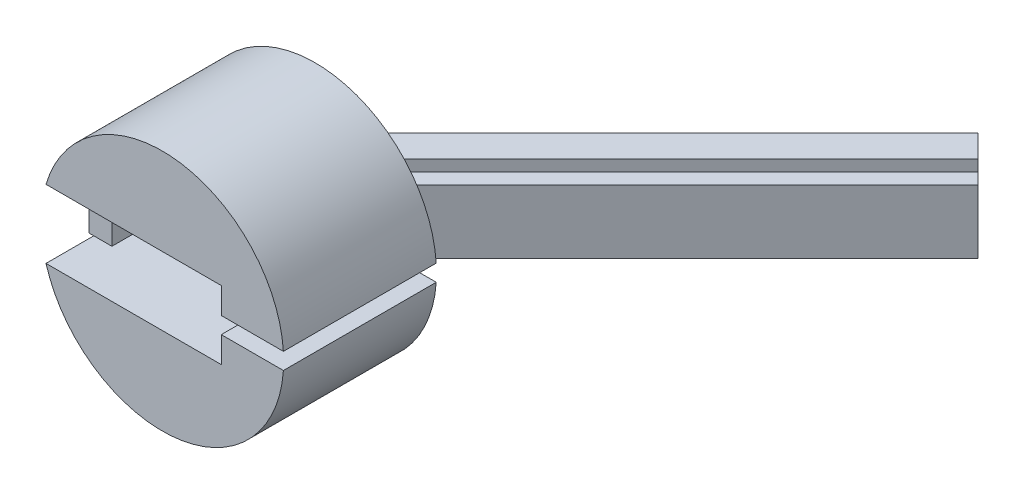
ISO-10303-21;
HEADER;
FILE_DESCRIPTION(('STEP AP214'),'2;1');
FILE_NAME('part.step','',(''),(''),'','','');
FILE_SCHEMA(('AUTOMOTIVE_DESIGN { 1 0 10303 214 1 1 1 1 }'));
ENDSEC;
DATA;
#1=APPLICATION_CONTEXT('core data for automotive mechanical design processes');
#2=APPLICATION_PROTOCOL_DEFINITION('international standard','automotive_design',2000,#1);
#3=PRODUCT_CONTEXT('',#1,'mechanical');
#4=PRODUCT('Part','Part','',(#3));
#5=PRODUCT_RELATED_PRODUCT_CATEGORY('part','',(#4));
#6=PRODUCT_DEFINITION_FORMATION('','',#4);
#7=PRODUCT_DEFINITION_CONTEXT('part definition',#1,'design');
#8=PRODUCT_DEFINITION('design','',#6,#7);
#9=PRODUCT_DEFINITION_SHAPE('','',#8);
#10=(LENGTH_UNIT() NAMED_UNIT(*) SI_UNIT(.MILLI.,.METRE.));
#11=(NAMED_UNIT(*) PLANE_ANGLE_UNIT() SI_UNIT($,.RADIAN.));
#12=(NAMED_UNIT(*) SI_UNIT($,.STERADIAN.) SOLID_ANGLE_UNIT());
#13=UNCERTAINTY_MEASURE_WITH_UNIT(LENGTH_MEASURE(1.E-05),#10,'distance_accuracy_value','');
#14=(GEOMETRIC_REPRESENTATION_CONTEXT(3) GLOBAL_UNCERTAINTY_ASSIGNED_CONTEXT((#13)) GLOBAL_UNIT_ASSIGNED_CONTEXT((#10,
#11,#12)) REPRESENTATION_CONTEXT('',''));
#15=CARTESIAN_POINT('',(0.,0.,0.));
#16=DIRECTION('',(0.,0.,1.));
#17=DIRECTION('',(1.,0.,0.));
#18=AXIS2_PLACEMENT_3D('',#15,#16,#17);
#19=CARTESIAN_POINT('',(0.,0.,0.));
#20=DIRECTION('',(0.,0.,1.));
#21=DIRECTION('',(1.,0.,0.));
#22=AXIS2_PLACEMENT_3D('',#19,#20,#21);
#23=PLANE('',#22);
#24=DIRECTION('',(1.,0.,0.));
#25=VECTOR('',#24,1.);
#26=CARTESIAN_POINT('',(-36.5522478279135,10.749101298564,0.));
#27=LINE('',#26,#25);
#28=CARTESIAN_POINT('',(-36.5522478279135,10.749101298564,0.));
#29=VERTEX_POINT('',#28);
#30=CARTESIAN_POINT('',(-30.84910129856,10.749101298564,0.));
#31=VERTEX_POINT('',#30);
#32=EDGE_CURVE('E49',#29,#31,#27,.T.);
#33=ORIENTED_EDGE('',*,*,#32,.F.);
#34=DIRECTION('',(1.,0.,0.));
#35=VECTOR('',#34,1.);
#36=CARTESIAN_POINT('',(-38.1,10.749101298564,0.));
#37=LINE('',#36,#35);
#38=CARTESIAN_POINT('',(-38.1,10.749101298564,0.));
#39=VERTEX_POINT('',#38);
#40=EDGE_CURVE('E461',#39,#29,#37,.T.);
#41=ORIENTED_EDGE('',*,*,#40,.F.);
#42=DIRECTION('',(0.,1.,0.));
#43=VECTOR('',#42,1.);
#44=CARTESIAN_POINT('',(-38.1,-10.749101298564,0.));
#45=LINE('',#44,#43);
#46=CARTESIAN_POINT('',(-38.1,-10.749101298564,0.));
#47=VERTEX_POINT('',#46);
#48=EDGE_CURVE('E460',#47,#39,#45,.T.);
#49=ORIENTED_EDGE('',*,*,#48,.F.);
#50=DIRECTION('',(1.,0.,0.));
#51=VECTOR('',#50,1.);
#52=CARTESIAN_POINT('',(-38.1,-10.749101298564,0.));
#53=LINE('',#52,#51);
#54=CARTESIAN_POINT('',(-36.5522478279135,-10.749101298564,0.));
#55=VERTEX_POINT('',#54);
#56=EDGE_CURVE('E454',#47,#55,#53,.T.);
#57=ORIENTED_EDGE('',*,*,#56,.T.);
#58=DIRECTION('',(-1.,0.,0.));
#59=VECTOR('',#58,1.);
#60=CARTESIAN_POINT('',(-36.5522478279135,-10.749101298564,0.));
#61=LINE('',#60,#59);
#62=CARTESIAN_POINT('',(-30.84910129856,-10.74910129856,0.));
#63=VERTEX_POINT('',#62);
#64=EDGE_CURVE('E48',#63,#55,#61,.T.);
#65=ORIENTED_EDGE('',*,*,#64,.F.);
#66=DIRECTION('',(0.,-1.,0.));
#67=VECTOR('',#66,1.);
#68=CARTESIAN_POINT('',(-30.84910129856,10.749101298564,0.));
#69=LINE('',#68,#67);
#70=EDGE_CURVE('E443',#31,#63,#69,.T.);
#71=ORIENTED_EDGE('',*,*,#70,.F.);
#72=EDGE_LOOP('',(#33,#41,#49,#57,#65,#71));
#73=FACE_BOUND('',#72,.T.);
#74=ADVANCED_FACE('F39',(#73),#23,.T.);
#75=DIRECTION('',(0.,-1.,0.));
#76=VECTOR('',#75,1.);
#77=CARTESIAN_POINT('',(18.5,10.749101298564,0.));
#78=LINE('',#77,#76);
#79=CARTESIAN_POINT('',(18.5,10.749101298564,0.));
#80=VERTEX_POINT('',#79);
#81=CARTESIAN_POINT('',(18.5,2.6,0.));
#82=VERTEX_POINT('',#81);
#83=EDGE_CURVE('E272',#80,#82,#78,.T.);
#84=ORIENTED_EDGE('',*,*,#83,.F.);
#85=CARTESIAN_POINT('',(10.849101298564,10.749101298564,0.));
#86=VERTEX_POINT('',#85);
#87=EDGE_CURVE('E11',#86,#80,#27,.T.);
#88=ORIENTED_EDGE('',*,*,#87,.F.);
#89=DIRECTION('',(0.,1.,0.));
#90=VECTOR('',#89,1.);
#91=CARTESIAN_POINT('',(10.849101298564,4.6,0.));
#92=LINE('',#91,#90);
#93=CARTESIAN_POINT('',(10.849101298564,4.6,0.));
#94=VERTEX_POINT('',#93);
#95=EDGE_CURVE('E441',#94,#86,#92,.T.);
#96=ORIENTED_EDGE('',*,*,#95,.F.);
#97=DIRECTION('',(-0.707106781186547,0.707106781186548,0.));
#98=VECTOR('',#97,1.);
#99=CARTESIAN_POINT('',(12.849101298564,2.6,0.));
#100=LINE('',#99,#98);
#101=CARTESIAN_POINT('',(12.849101298564,2.6,0.));
#102=VERTEX_POINT('',#101);
#103=EDGE_CURVE('E438',#102,#94,#100,.T.);
#104=ORIENTED_EDGE('',*,*,#103,.F.);
#105=DIRECTION('',(-1.,0.,0.));
#106=VECTOR('',#105,1.);
#107=CARTESIAN_POINT('',(38.0111825651347,2.6,0.));
#108=LINE('',#107,#106);
#109=EDGE_CURVE('E64',#82,#102,#108,.T.);
#110=ORIENTED_EDGE('',*,*,#109,.F.);
#111=EDGE_LOOP('',(#84,#88,#96,#104,#110));
#112=FACE_BOUND('',#111,.T.);
#113=ADVANCED_FACE('F497',(#112),#23,.T.);
#114=CARTESIAN_POINT('',(0.,0.,-33.));
#115=DIRECTION('',(0.,0.,-1.));
#116=DIRECTION('',(-1.,0.,0.));
#117=AXIS2_PLACEMENT_3D('',#114,#115,#116);
#118=PLANE('',#117);
#119=CARTESIAN_POINT('',(0.,0.,-33.));
#120=DIRECTION('',(0.,0.,-1.));
#121=DIRECTION('',(-1.,0.,0.));
#122=AXIS2_PLACEMENT_3D('',#119,#120,#121);
#123=CIRCLE('',#122,38.1);
#124=CARTESIAN_POINT('',(-36.5522478279135,10.749101298564,-33.));
#125=VERTEX_POINT('',#124);
#126=CARTESIAN_POINT('',(38.0111825651347,2.6,-33.));
#127=VERTEX_POINT('',#126);
#128=EDGE_CURVE('E391',#125,#127,#123,.T.);
#129=ORIENTED_EDGE('',*,*,#128,.T.);
#130=DIRECTION('',(-1.,0.,0.));
#131=VECTOR('',#130,1.);
#132=CARTESIAN_POINT('',(38.0111825651347,2.6,-33.));
#133=LINE('',#132,#131);
#134=CARTESIAN_POINT('',(12.849101298564,2.6,-33.));
#135=VERTEX_POINT('',#134);
#136=EDGE_CURVE('E392',#127,#135,#133,.T.);
#137=ORIENTED_EDGE('',*,*,#136,.T.);
#138=DIRECTION('',(0.,-1.,0.));
#139=VECTOR('',#138,1.);
#140=CARTESIAN_POINT('',(12.849101298564,2.6,-33.));
#141=LINE('',#140,#139);
#142=CARTESIAN_POINT('',(12.849101298564,-2.6,-33.));
#143=VERTEX_POINT('',#142);
#144=EDGE_CURVE('E400',#135,#143,#141,.T.);
#145=ORIENTED_EDGE('',*,*,#144,.T.);
#146=DIRECTION('',(1.,0.,0.));
#147=VECTOR('',#146,1.);
#148=CARTESIAN_POINT('',(12.849101298564,-2.6,-33.));
#149=LINE('',#148,#147);
#150=CARTESIAN_POINT('',(38.0111825651347,-2.60000000000001,-33.));
#151=VERTEX_POINT('',#150);
#152=EDGE_CURVE('E397',#143,#151,#149,.T.);
#153=ORIENTED_EDGE('',*,*,#152,.T.);
#154=CARTESIAN_POINT('',(0.,0.,-33.));
#155=DIRECTION('',(0.,0.,-1.));
#156=DIRECTION('',(-1.,0.,0.));
#157=AXIS2_PLACEMENT_3D('',#154,#155,#156);
#158=CIRCLE('',#157,38.1);
#159=CARTESIAN_POINT('',(-36.5522478279135,-10.749101298564,-33.));
#160=VERTEX_POINT('',#159);
#161=EDGE_CURVE('E405',#151,#160,#158,.T.);
#162=ORIENTED_EDGE('',*,*,#161,.T.);
#163=DIRECTION('',(-1.,0.,0.));
#164=VECTOR('',#163,1.);
#165=CARTESIAN_POINT('',(-36.5522478279135,-10.749101298564,-33.));
#166=LINE('',#165,#164);
#167=CARTESIAN_POINT('',(-38.1,-10.749101298564,-33.));
#168=VERTEX_POINT('',#167);
#169=EDGE_CURVE('E403',#160,#168,#166,.T.);
#170=ORIENTED_EDGE('',*,*,#169,.T.);
#171=DIRECTION('',(0.,1.,0.));
#172=VECTOR('',#171,1.);
#173=CARTESIAN_POINT('',(-38.1,-10.749101298564,-33.));
#174=LINE('',#173,#172);
#175=CARTESIAN_POINT('',(-38.1,10.749101298564,-33.));
#176=VERTEX_POINT('',#175);
#177=EDGE_CURVE('E407',#168,#176,#174,.T.);
#178=ORIENTED_EDGE('',*,*,#177,.T.);
#179=DIRECTION('',(1.,0.,0.));
#180=VECTOR('',#179,1.);
#181=CARTESIAN_POINT('',(-38.1,10.749101298564,-33.));
#182=LINE('',#181,#180);
#183=EDGE_CURVE('E414',#176,#125,#182,.T.);
#184=ORIENTED_EDGE('',*,*,#183,.T.);
#185=EDGE_LOOP('',(#129,#137,#145,#153,#162,#170,#178,#184));
#186=FACE_BOUND('',#185,.T.);
#187=DIRECTION('',(0.,-1.,0.));
#188=VECTOR('',#187,1.);
#189=CARTESIAN_POINT('',(-3.95786437626908,10.,-33.));
#190=LINE('',#189,#188);
#191=CARTESIAN_POINT('',(-3.95786437626908,-5.,-33.));
#192=VERTEX_POINT('',#191);
#193=CARTESIAN_POINT('',(-3.95786437626908,-10.,-33.));
#194=VERTEX_POINT('',#193);
#195=EDGE_CURVE('E390',#192,#194,#190,.T.);
#196=ORIENTED_EDGE('',*,*,#195,.F.);
#197=DIRECTION('',(1.,0.,0.));
#198=VECTOR('',#197,1.);
#199=CARTESIAN_POINT('',(-15.9728306023233,-5.,-33.));
#200=LINE('',#199,#198);
#201=CARTESIAN_POINT('',(3.11320343559663,-5.,-33.));
#202=VERTEX_POINT('',#201);
#203=EDGE_CURVE('E318',#192,#202,#200,.T.);
#204=ORIENTED_EDGE('',*,*,#203,.T.);
#205=DIRECTION('',(0.,-1.,0.));
#206=VECTOR('',#205,1.);
#207=CARTESIAN_POINT('',(3.11320343559663,-10.,-33.));
#208=LINE('',#207,#206);
#209=CARTESIAN_POINT('',(3.11320343559663,-10.,-33.));
#210=VERTEX_POINT('',#209);
#211=EDGE_CURVE('E319',#202,#210,#208,.T.);
#212=ORIENTED_EDGE('',*,*,#211,.T.);
#213=DIRECTION('',(1.,0.,0.));
#214=VECTOR('',#213,1.);
#215=CARTESIAN_POINT('',(-12.4372966963906,-10.,-33.));
#216=LINE('',#215,#214);
#217=CARTESIAN_POINT('',(10.1842712474621,-10.,-33.));
#218=VERTEX_POINT('',#217);
#219=EDGE_CURVE('E317',#210,#218,#216,.T.);
#220=ORIENTED_EDGE('',*,*,#219,.T.);
#221=DIRECTION('',(0.,1.,0.));
#222=VECTOR('',#221,1.);
#223=CARTESIAN_POINT('',(10.1842712474621,10.,-33.));
#224=LINE('',#223,#222);
#225=CARTESIAN_POINT('',(10.1842712474621,10.,-33.));
#226=VERTEX_POINT('',#225);
#227=EDGE_CURVE('E313',#218,#226,#224,.T.);
#228=ORIENTED_EDGE('',*,*,#227,.T.);
#229=DIRECTION('',(-1.,0.,0.));
#230=VECTOR('',#229,1.);
#231=CARTESIAN_POINT('',(-15.9728306023233,10.,-33.));
#232=LINE('',#231,#230);
#233=CARTESIAN_POINT('',(3.11320343559663,10.,-33.));
#234=VERTEX_POINT('',#233);
#235=EDGE_CURVE('E311',#226,#234,#232,.T.);
#236=ORIENTED_EDGE('',*,*,#235,.T.);
#237=DIRECTION('',(0.,-1.,0.));
#238=VECTOR('',#237,1.);
#239=CARTESIAN_POINT('',(3.11320343559663,5.,-33.));
#240=LINE('',#239,#238);
#241=CARTESIAN_POINT('',(3.11320343559663,5.,-33.));
#242=VERTEX_POINT('',#241);
#243=EDGE_CURVE('E307',#234,#242,#240,.T.);
#244=ORIENTED_EDGE('',*,*,#243,.T.);
#245=DIRECTION('',(-1.,0.,0.));
#246=VECTOR('',#245,1.);
#247=CARTESIAN_POINT('',(-19.5083645082561,5.,-33.));
#248=LINE('',#247,#246);
#249=CARTESIAN_POINT('',(-3.95786437626908,5.,-33.));
#250=VERTEX_POINT('',#249);
#251=EDGE_CURVE('E321',#242,#250,#248,.T.);
#252=ORIENTED_EDGE('',*,*,#251,.T.);
#253=CARTESIAN_POINT('',(-3.95786437626908,10.,-33.));
#254=VERTEX_POINT('',#253);
#255=EDGE_CURVE('E387',#254,#250,#190,.T.);
#256=ORIENTED_EDGE('',*,*,#255,.F.);
#257=DIRECTION('',(1.,0.,0.));
#258=VECTOR('',#257,1.);
#259=CARTESIAN_POINT('',(-18.1,10.,-33.));
#260=LINE('',#259,#258);
#261=CARTESIAN_POINT('',(-18.1,10.,-33.));
#262=VERTEX_POINT('',#261);
#263=EDGE_CURVE('E356',#262,#254,#260,.T.);
#264=ORIENTED_EDGE('',*,*,#263,.F.);
#265=DIRECTION('',(0.,-1.,0.));
#266=VECTOR('',#265,1.);
#267=CARTESIAN_POINT('',(-18.1,10.,-33.));
#268=LINE('',#267,#266);
#269=CARTESIAN_POINT('',(-18.1,-10.,-33.));
#270=VERTEX_POINT('',#269);
#271=EDGE_CURVE('E368',#262,#270,#268,.T.);
#272=ORIENTED_EDGE('',*,*,#271,.T.);
#273=DIRECTION('',(1.,0.,0.));
#274=VECTOR('',#273,1.);
#275=CARTESIAN_POINT('',(-18.1,-10.,-33.));
#276=LINE('',#275,#274);
#277=EDGE_CURVE('E357',#270,#194,#276,.T.);
#278=ORIENTED_EDGE('',*,*,#277,.T.);
#279=EDGE_LOOP('',(#196,#204,#212,#220,#228,#236,#244,#252,#256,#264,#272,#278));
#280=FACE_BOUND('',#279,.T.);
#281=ADVANCED_FACE('F519',(#186,#280),#118,.T.);
#282=CARTESIAN_POINT('',(-3.95786437626908,10.,-33.));
#283=DIRECTION('',(-0.707106781186549,0.,-0.707106781186546));
#284=DIRECTION('',(-0.707106781186546,0.,0.707106781186549));
#285=AXIS2_PLACEMENT_3D('',#282,#283,#284);
#286=PLANE('',#285);
#287=DIRECTION('',(0.707106781186545,0.,-0.70710678118655));
#288=VECTOR('',#287,1.);
#289=CARTESIAN_POINT('',(-19.5083645082562,-5.,-17.4494998680128));
#290=LINE('',#289,#288);
#291=CARTESIAN_POINT('',(102.108152801713,-5.,-139.066017177982));
#292=VERTEX_POINT('',#291);
#293=EDGE_CURVE('E315',#192,#292,#290,.T.);
#294=ORIENTED_EDGE('',*,*,#293,.F.);
#295=ORIENTED_EDGE('',*,*,#195,.T.);
#296=DIRECTION('',(0.707106781186546,0.,-0.707106781186549));
#297=VECTOR('',#296,1.);
#298=CARTESIAN_POINT('',(-3.95786437626908,-10.,-33.));
#299=LINE('',#298,#297);
#300=CARTESIAN_POINT('',(102.108152801713,-10.,-139.066017177982));
#301=VERTEX_POINT('',#300);
#302=EDGE_CURVE('E371',#194,#301,#299,.T.);
#303=ORIENTED_EDGE('',*,*,#302,.T.);
#304=DIRECTION('',(0.,-1.,0.));
#305=VECTOR('',#304,1.);
#306=CARTESIAN_POINT('',(102.108152801713,10.,-139.066017177982));
#307=LINE('',#306,#305);
#308=EDGE_CURVE('E384',#292,#301,#307,.T.);
#309=ORIENTED_EDGE('',*,*,#308,.F.);
#310=EDGE_LOOP('',(#294,#295,#303,#309));
#311=FACE_BOUND('',#310,.T.);
#312=ADVANCED_FACE('F613',(#311),#286,.F.);
#313=CARTESIAN_POINT('',(38.0111825651347,2.6,-135.700288353668));
#314=DIRECTION('',(0.,1.,0.));
#315=DIRECTION('',(0.,0.,1.));
#316=AXIS2_PLACEMENT_3D('',#313,#314,#315);
#317=PLANE('',#316);
#318=DIRECTION('',(0.,0.,1.));
#319=VECTOR('',#318,1.);
#320=CARTESIAN_POINT('',(12.849101298564,2.6,-135.700288353668));
#321=LINE('',#320,#319);
#322=CARTESIAN_POINT('',(12.849101298564,2.6,-28.));
#323=VERTEX_POINT('',#322);
#324=EDGE_CURVE('E43',#323,#102,#321,.T.);
#325=ORIENTED_EDGE('',*,*,#324,.F.);
#326=DIRECTION('',(0.,0.,1.));
#327=VECTOR('',#326,1.);
#328=CARTESIAN_POINT('',(12.849101298564,2.6,-33.));
#329=LINE('',#328,#327);
#330=EDGE_CURVE('E417',#135,#323,#329,.T.);
#331=ORIENTED_EDGE('',*,*,#330,.F.);
#332=ORIENTED_EDGE('',*,*,#136,.F.);
#333=DIRECTION('',(0.,0.,1.));
#334=VECTOR('',#333,1.);
#335=CARTESIAN_POINT('',(38.0111825651347,2.6,-135.700288353668));
#336=LINE('',#335,#334);
#337=CARTESIAN_POINT('',(38.0111825651347,2.6,15.));
#338=VERTEX_POINT('',#337);
#339=EDGE_CURVE('E463',#127,#338,#336,.T.);
#340=ORIENTED_EDGE('',*,*,#339,.T.);
#341=DIRECTION('',(1.,0.,0.));
#342=VECTOR('',#341,1.);
#343=CARTESIAN_POINT('',(18.5,2.6,15.));
#344=LINE('',#343,#342);
#345=CARTESIAN_POINT('',(18.5,2.6,15.));
#346=VERTEX_POINT('',#345);
#347=EDGE_CURVE('E267',#346,#338,#344,.T.);
#348=ORIENTED_EDGE('',*,*,#347,.F.);
#349=DIRECTION('',(0.,0.,-1.));
#350=VECTOR('',#349,1.);
#351=CARTESIAN_POINT('',(18.5,2.6,15.));
#352=LINE('',#351,#350);
#353=EDGE_CURVE('E285',#346,#82,#352,.T.);
#354=ORIENTED_EDGE('',*,*,#353,.T.);
#355=ORIENTED_EDGE('',*,*,#109,.T.);
#356=EDGE_LOOP('',(#325,#331,#332,#340,#348,#354,#355));
#357=FACE_BOUND('',#356,.T.);
#358=ADVANCED_FACE('F41',(#357),#317,.F.);
#359=CARTESIAN_POINT('',(12.849101298564,2.6,-135.700288353668));
#360=DIRECTION('',(0.707106781186548,0.707106781186547,0.));
#361=DIRECTION('',(-0.707106781186547,0.707106781186548,0.));
#362=AXIS2_PLACEMENT_3D('',#359,#360,#361);
#363=PLANE('',#362);
#364=DIRECTION('',(0.,0.,1.));
#365=VECTOR('',#364,1.);
#366=CARTESIAN_POINT('',(10.849101298564,4.6,-135.700288353668));
#367=LINE('',#366,#365);
#368=CARTESIAN_POINT('',(10.849101298564,4.6,-28.));
#369=VERTEX_POINT('',#368);
#370=EDGE_CURVE('E486',#369,#94,#367,.T.);
#371=ORIENTED_EDGE('',*,*,#370,.F.);
#372=DIRECTION('',(0.707106781186547,-0.707106781186548,0.));
#373=VECTOR('',#372,1.);
#374=CARTESIAN_POINT('',(12.849101298564,2.6,-28.));
#375=LINE('',#374,#373);
#376=EDGE_CURVE('E434',#369,#323,#375,.T.);
#377=ORIENTED_EDGE('',*,*,#376,.T.);
#378=ORIENTED_EDGE('',*,*,#324,.T.);
#379=ORIENTED_EDGE('',*,*,#103,.T.);
#380=EDGE_LOOP('',(#371,#377,#378,#379));
#381=FACE_BOUND('',#380,.T.);
#382=ADVANCED_FACE('F494',(#381),#363,.F.);
#383=CARTESIAN_POINT('',(10.849101298564,4.6,-135.700288353668));
#384=DIRECTION('',(1.,0.,0.));
#385=DIRECTION('',(0.,0.,-1.));
#386=AXIS2_PLACEMENT_3D('',#383,#384,#385);
#387=PLANE('',#386);
#388=DIRECTION('',(0.,0.,1.));
#389=VECTOR('',#388,1.);
#390=CARTESIAN_POINT('',(10.849101298564,10.749101298564,-135.700288353668));
#391=LINE('',#390,#389);
#392=CARTESIAN_POINT('',(10.849101298564,10.749101298564,-28.));
#393=VERTEX_POINT('',#392);
#394=EDGE_CURVE('E488',#393,#86,#391,.T.);
#395=ORIENTED_EDGE('',*,*,#394,.F.);
#396=DIRECTION('',(0.,-1.,0.));
#397=VECTOR('',#396,1.);
#398=CARTESIAN_POINT('',(10.849101298564,4.6,-28.));
#399=LINE('',#398,#397);
#400=EDGE_CURVE('E433',#393,#369,#399,.T.);
#401=ORIENTED_EDGE('',*,*,#400,.T.);
#402=ORIENTED_EDGE('',*,*,#370,.T.);
#403=ORIENTED_EDGE('',*,*,#95,.T.);
#404=EDGE_LOOP('',(#395,#401,#402,#403));
#405=FACE_BOUND('',#404,.T.);
#406=ADVANCED_FACE('F501',(#405),#387,.F.);
#407=CARTESIAN_POINT('',(10.849101298564,10.749101298564,-135.700288353668));
#408=DIRECTION('',(0.,1.,0.));
#409=DIRECTION('',(0.,0.,1.));
#410=AXIS2_PLACEMENT_3D('',#407,#408,#409);
#411=PLANE('',#410);
#412=DIRECTION('',(0.,0.,1.));
#413=VECTOR('',#412,1.);
#414=CARTESIAN_POINT('',(-30.84910129856,10.749101298564,-135.700288353668));
#415=LINE('',#414,#413);
#416=CARTESIAN_POINT('',(-30.84910129856,10.749101298564,-28.));
#417=VERTEX_POINT('',#416);
#418=EDGE_CURVE('E482',#417,#31,#415,.T.);
#419=ORIENTED_EDGE('',*,*,#418,.F.);
#420=DIRECTION('',(1.,0.,0.));
#421=VECTOR('',#420,1.);
#422=CARTESIAN_POINT('',(10.849101298564,10.749101298564,-28.));
#423=LINE('',#422,#421);
#424=EDGE_CURVE('E431',#417,#393,#423,.T.);
#425=ORIENTED_EDGE('',*,*,#424,.T.);
#426=ORIENTED_EDGE('',*,*,#394,.T.);
#427=ORIENTED_EDGE('',*,*,#87,.T.);
#428=DIRECTION('',(0.,0.,-1.));
#429=VECTOR('',#428,1.);
#430=CARTESIAN_POINT('',(18.5,10.749101298564,15.));
#431=LINE('',#430,#429);
#432=CARTESIAN_POINT('',(18.5,10.749101298564,15.));
#433=VERTEX_POINT('',#432);
#434=EDGE_CURVE('E258',#433,#80,#431,.T.);
#435=ORIENTED_EDGE('',*,*,#434,.F.);
#436=DIRECTION('',(1.,0.,0.));
#437=VECTOR('',#436,1.);
#438=CARTESIAN_POINT('',(-36.5522478279135,10.749101298564,15.));
#439=LINE('',#438,#437);
#440=CARTESIAN_POINT('',(-36.5522478279135,10.749101298564,15.));
#441=VERTEX_POINT('',#440);
#442=EDGE_CURVE('E252',#441,#433,#439,.T.);
#443=ORIENTED_EDGE('',*,*,#442,.F.);
#444=DIRECTION('',(0.,0.,-1.));
#445=VECTOR('',#444,1.);
#446=CARTESIAN_POINT('',(-36.5522478279135,10.749101298564,15.));
#447=LINE('',#446,#445);
#448=EDGE_CURVE('E260',#441,#29,#447,.T.);
#449=ORIENTED_EDGE('',*,*,#448,.T.);
#450=ORIENTED_EDGE('',*,*,#32,.T.);
#451=EDGE_LOOP('',(#419,#425,#426,#427,#435,#443,#449,#450));
#452=FACE_BOUND('',#451,.T.);
#453=ADVANCED_FACE('F251',(#452),#411,.F.);
#454=CARTESIAN_POINT('',(-30.84910129856,10.749101298564,-135.700288353668));
#455=DIRECTION('',(-1.,0.,0.));
#456=DIRECTION('',(0.,0.,1.));
#457=AXIS2_PLACEMENT_3D('',#454,#455,#456);
#458=PLANE('',#457);
#459=DIRECTION('',(0.,0.,1.));
#460=VECTOR('',#459,1.);
#461=CARTESIAN_POINT('',(-30.84910129856,-10.74910129856,-135.700288353668));
#462=LINE('',#461,#460);
#463=CARTESIAN_POINT('',(-30.84910129856,-10.74910129856,-28.));
#464=VERTEX_POINT('',#463);
#465=EDGE_CURVE('E481',#464,#63,#462,.T.);
#466=ORIENTED_EDGE('',*,*,#465,.F.);
#467=DIRECTION('',(0.,1.,0.));
#468=VECTOR('',#467,1.);
#469=CARTESIAN_POINT('',(-30.84910129856,10.749101298564,-28.));
#470=LINE('',#469,#468);
#471=EDGE_CURVE('E429',#464,#417,#470,.T.);
#472=ORIENTED_EDGE('',*,*,#471,.T.);
#473=ORIENTED_EDGE('',*,*,#418,.T.);
#474=ORIENTED_EDGE('',*,*,#70,.T.);
#475=EDGE_LOOP('',(#466,#472,#473,#474));
#476=FACE_BOUND('',#475,.T.);
#477=ADVANCED_FACE('F541',(#476),#458,.F.);
#478=CARTESIAN_POINT('',(-30.84910129856,-10.74910129856,-135.700288353668));
#479=DIRECTION('',(0.,-1.,0.));
#480=DIRECTION('',(0.,0.,-1.));
#481=AXIS2_PLACEMENT_3D('',#478,#479,#480);
#482=PLANE('',#481);
#483=DIRECTION('',(0.,0.,1.));
#484=VECTOR('',#483,1.);
#485=CARTESIAN_POINT('',(10.849101298564,-10.74910129856,-135.700288353668));
#486=LINE('',#485,#484);
#487=CARTESIAN_POINT('',(10.849101298564,-10.74910129856,-28.));
#488=VERTEX_POINT('',#487);
#489=CARTESIAN_POINT('',(10.849101298564,-10.74910129856,0.));
#490=VERTEX_POINT('',#489);
#491=EDGE_CURVE('E478',#488,#490,#486,.T.);
#492=ORIENTED_EDGE('',*,*,#491,.F.);
#493=DIRECTION('',(-1.,0.,0.));
#494=VECTOR('',#493,1.);
#495=CARTESIAN_POINT('',(-30.84910129856,-10.74910129856,-28.));
#496=LINE('',#495,#494);
#497=EDGE_CURVE('E430',#488,#464,#496,.T.);
#498=ORIENTED_EDGE('',*,*,#497,.T.);
#499=ORIENTED_EDGE('',*,*,#465,.T.);
#500=ORIENTED_EDGE('',*,*,#64,.T.);
#501=DIRECTION('',(0.,0.,-1.));
#502=VECTOR('',#501,1.);
#503=CARTESIAN_POINT('',(-36.5522478279135,-10.749101298564,15.));
#504=LINE('',#503,#502);
#505=CARTESIAN_POINT('',(-36.5522478279135,-10.749101298564,15.));
#506=VERTEX_POINT('',#505);
#507=EDGE_CURVE('E291',#506,#55,#504,.T.);
#508=ORIENTED_EDGE('',*,*,#507,.F.);
#509=DIRECTION('',(-1.,0.,0.));
#510=VECTOR('',#509,1.);
#511=CARTESIAN_POINT('',(-36.5522478279135,-10.749101298564,15.));
#512=LINE('',#511,#510);
#513=CARTESIAN_POINT('',(18.5,-10.749101298564,15.));
#514=VERTEX_POINT('',#513);
#515=EDGE_CURVE('E298',#514,#506,#512,.T.);
#516=ORIENTED_EDGE('',*,*,#515,.F.);
#517=DIRECTION('',(0.,0.,-1.));
#518=VECTOR('',#517,1.);
#519=CARTESIAN_POINT('',(18.5,-10.749101298564,15.));
#520=LINE('',#519,#518);
#521=CARTESIAN_POINT('',(18.5,-10.749101298564,0.));
#522=VERTEX_POINT('',#521);
#523=EDGE_CURVE('E289',#514,#522,#520,.T.);
#524=ORIENTED_EDGE('',*,*,#523,.T.);
#525=EDGE_CURVE('E300',#522,#490,#61,.T.);
#526=ORIENTED_EDGE('',*,*,#525,.T.);
#527=EDGE_LOOP('',(#492,#498,#499,#500,#508,#516,#524,#526));
#528=FACE_BOUND('',#527,.T.);
#529=ADVANCED_FACE('F540',(#528),#482,.F.);
#530=CARTESIAN_POINT('',(10.849101298564,-10.74910129856,-135.700288353668));
#531=DIRECTION('',(1.,0.,0.));
#532=DIRECTION('',(0.,0.,-1.));
#533=AXIS2_PLACEMENT_3D('',#530,#531,#532);
#534=PLANE('',#533);
#535=DIRECTION('',(0.,0.,1.));
#536=VECTOR('',#535,1.);
#537=CARTESIAN_POINT('',(10.849101298564,-4.60000000000004,-135.700288353668));
#538=LINE('',#537,#536);
#539=CARTESIAN_POINT('',(10.849101298564,-4.60000000000004,-28.));
#540=VERTEX_POINT('',#539);
#541=CARTESIAN_POINT('',(10.849101298564,-4.60000000000004,0.));
#542=VERTEX_POINT('',#541);
#543=EDGE_CURVE('E476',#540,#542,#538,.T.);
#544=ORIENTED_EDGE('',*,*,#543,.F.);
#545=DIRECTION('',(0.,-1.,0.));
#546=VECTOR('',#545,1.);
#547=CARTESIAN_POINT('',(10.849101298564,-10.74910129856,-28.));
#548=LINE('',#547,#546);
#549=EDGE_CURVE('E424',#540,#488,#548,.T.);
#550=ORIENTED_EDGE('',*,*,#549,.T.);
#551=ORIENTED_EDGE('',*,*,#491,.T.);
#552=DIRECTION('',(0.,1.,0.));
#553=VECTOR('',#552,1.);
#554=CARTESIAN_POINT('',(10.849101298564,-10.74910129856,0.));
#555=LINE('',#554,#553);
#556=EDGE_CURVE('E450',#490,#542,#555,.T.);
#557=ORIENTED_EDGE('',*,*,#556,.T.);
#558=EDGE_LOOP('',(#544,#550,#551,#557));
#559=FACE_BOUND('',#558,.T.);
#560=ADVANCED_FACE('F593',(#559),#534,.F.);
#561=CARTESIAN_POINT('',(12.849101298564,-2.6,-135.700288353668));
#562=DIRECTION('',(-0.707106781186554,0.707106781186541,0.));
#563=DIRECTION('',(-0.707106781186541,-0.707106781186554,0.));
#564=AXIS2_PLACEMENT_3D('',#561,#562,#563);
#565=PLANE('',#564);
#566=DIRECTION('',(0.707106781186541,0.707106781186554,0.));
#567=VECTOR('',#566,1.);
#568=CARTESIAN_POINT('',(12.849101298564,-2.6,-28.));
#569=LINE('',#568,#567);
#570=CARTESIAN_POINT('',(12.849101298564,-2.6,-28.));
#571=VERTEX_POINT('',#570);
#572=EDGE_CURVE('E422',#540,#571,#569,.T.);
#573=ORIENTED_EDGE('',*,*,#572,.F.);
#574=ORIENTED_EDGE('',*,*,#543,.T.);
#575=DIRECTION('',(-0.707106781186541,-0.707106781186554,0.));
#576=VECTOR('',#575,1.);
#577=CARTESIAN_POINT('',(12.849101298564,-2.6,0.));
#578=LINE('',#577,#576);
#579=CARTESIAN_POINT('',(12.849101298564,-2.6,0.));
#580=VERTEX_POINT('',#579);
#581=EDGE_CURVE('E448',#580,#542,#578,.T.);
#582=ORIENTED_EDGE('',*,*,#581,.F.);
#583=DIRECTION('',(0.,0.,1.));
#584=VECTOR('',#583,1.);
#585=CARTESIAN_POINT('',(12.849101298564,-2.6,-135.700288353668));
#586=LINE('',#585,#584);
#587=EDGE_CURVE('E473',#571,#580,#586,.T.);
#588=ORIENTED_EDGE('',*,*,#587,.F.);
#589=EDGE_LOOP('',(#573,#574,#582,#588));
#590=FACE_BOUND('',#589,.T.);
#591=ADVANCED_FACE('F587',(#590),#565,.T.);
#592=CARTESIAN_POINT('',(38.0111825651347,-2.6,-135.700288353668));
#593=DIRECTION('',(0.,1.,0.));
#594=DIRECTION('',(-1.,0.,0.));
#595=AXIS2_PLACEMENT_3D('',#592,#593,#594);
#596=PLANE('',#595);
#597=DIRECTION('',(0.,0.,1.));
#598=VECTOR('',#597,1.);
#599=CARTESIAN_POINT('',(38.0111825651347,-2.60000000000002,-135.700288353668));
#600=LINE('',#599,#598);
#601=CARTESIAN_POINT('',(38.0111825651347,-2.60000000000002,15.));
#602=VERTEX_POINT('',#601);
#603=EDGE_CURVE('E475',#151,#602,#600,.T.);
#604=ORIENTED_EDGE('',*,*,#603,.F.);
#605=ORIENTED_EDGE('',*,*,#152,.F.);
#606=DIRECTION('',(0.,0.,1.));
#607=VECTOR('',#606,1.);
#608=CARTESIAN_POINT('',(12.849101298564,-2.6,-33.));
#609=LINE('',#608,#607);
#610=EDGE_CURVE('E413',#143,#571,#609,.T.);
#611=ORIENTED_EDGE('',*,*,#610,.T.);
#612=ORIENTED_EDGE('',*,*,#587,.T.);
#613=DIRECTION('',(-1.,0.,0.));
#614=VECTOR('',#613,1.);
#615=CARTESIAN_POINT('',(38.0111825651347,-2.6,0.));
#616=LINE('',#615,#614);
#617=CARTESIAN_POINT('',(18.5,-2.6,0.));
#618=VERTEX_POINT('',#617);
#619=EDGE_CURVE('E452',#618,#580,#616,.T.);
#620=ORIENTED_EDGE('',*,*,#619,.F.);
#621=DIRECTION('',(0.,0.,-1.));
#622=VECTOR('',#621,1.);
#623=CARTESIAN_POINT('',(18.5,-2.60000000000002,15.));
#624=LINE('',#623,#622);
#625=CARTESIAN_POINT('',(18.5,-2.60000000000002,15.));
#626=VERTEX_POINT('',#625);
#627=EDGE_CURVE('E290',#626,#618,#624,.T.);
#628=ORIENTED_EDGE('',*,*,#627,.F.);
#629=DIRECTION('',(-1.,0.,0.));
#630=VECTOR('',#629,1.);
#631=CARTESIAN_POINT('',(18.5,-2.60000000000002,15.));
#632=LINE('',#631,#630);
#633=EDGE_CURVE('E304',#602,#626,#632,.T.);
#634=ORIENTED_EDGE('',*,*,#633,.F.);
#635=EDGE_LOOP('',(#604,#605,#611,#612,#620,#628,#634));
#636=FACE_BOUND('',#635,.T.);
#637=ADVANCED_FACE('F513',(#636),#596,.T.);
#638=CARTESIAN_POINT('',(0.,0.,-135.700288353668));
#639=DIRECTION('',(0.,0.,1.));
#640=DIRECTION('',(1.,0.,0.));
#641=AXIS2_PLACEMENT_3D('',#638,#639,#640);
#642=CYLINDRICAL_SURFACE('',#641,38.1);
#643=DIRECTION('',(0.,0.,1.));
#644=VECTOR('',#643,1.);
#645=CARTESIAN_POINT('',(-36.5522478279135,-10.749101298564,-135.700288353668));
#646=LINE('',#645,#644);
#647=EDGE_CURVE('E468',#160,#55,#646,.T.);
#648=ORIENTED_EDGE('',*,*,#647,.F.);
#649=ORIENTED_EDGE('',*,*,#161,.F.);
#650=ORIENTED_EDGE('',*,*,#603,.T.);
#651=CARTESIAN_POINT('',(0.,0.,15.));
#652=DIRECTION('',(0.,0.,1.));
#653=DIRECTION('',(1.,0.,0.));
#654=AXIS2_PLACEMENT_3D('',#651,#652,#653);
#655=CIRCLE('',#654,38.1);
#656=EDGE_CURVE('E297',#506,#602,#655,.T.);
#657=ORIENTED_EDGE('',*,*,#656,.F.);
#658=ORIENTED_EDGE('',*,*,#507,.T.);
#659=EDGE_LOOP('',(#648,#649,#650,#657,#658));
#660=FACE_BOUND('',#659,.T.);
#661=ADVANCED_FACE('F523',(#660),#642,.T.);
#662=CARTESIAN_POINT('',(-38.1,-10.749101298564,-135.700288353668));
#663=DIRECTION('',(0.,-1.,0.));
#664=DIRECTION('',(0.,0.,-1.));
#665=AXIS2_PLACEMENT_3D('',#662,#663,#664);
#666=PLANE('',#665);
#667=DIRECTION('',(0.,0.,1.));
#668=VECTOR('',#667,1.);
#669=CARTESIAN_POINT('',(-38.1,-10.749101298564,-135.700288353668));
#670=LINE('',#669,#668);
#671=EDGE_CURVE('E466',#168,#47,#670,.T.);
#672=ORIENTED_EDGE('',*,*,#671,.F.);
#673=ORIENTED_EDGE('',*,*,#169,.F.);
#674=ORIENTED_EDGE('',*,*,#647,.T.);
#675=ORIENTED_EDGE('',*,*,#56,.F.);
#676=EDGE_LOOP('',(#672,#673,#674,#675));
#677=FACE_BOUND('',#676,.T.);
#678=ADVANCED_FACE('F527',(#677),#666,.T.);
#679=CARTESIAN_POINT('',(-38.1,-10.749101298564,-135.700288353668));
#680=DIRECTION('',(1.,0.,0.));
#681=DIRECTION('',(0.,1.,0.));
#682=AXIS2_PLACEMENT_3D('',#679,#680,#681);
#683=PLANE('',#682);
#684=DIRECTION('',(0.,0.,1.));
#685=VECTOR('',#684,1.);
#686=CARTESIAN_POINT('',(-38.1,10.749101298564,-135.700288353668));
#687=LINE('',#686,#685);
#688=EDGE_CURVE('E467',#176,#39,#687,.T.);
#689=ORIENTED_EDGE('',*,*,#688,.F.);
#690=ORIENTED_EDGE('',*,*,#177,.F.);
#691=ORIENTED_EDGE('',*,*,#671,.T.);
#692=ORIENTED_EDGE('',*,*,#48,.T.);
#693=EDGE_LOOP('',(#689,#690,#691,#692));
#694=FACE_BOUND('',#693,.T.);
#695=ADVANCED_FACE('F558',(#694),#683,.F.);
#696=CARTESIAN_POINT('',(-38.1,10.749101298564,-135.700288353668));
#697=DIRECTION('',(0.,-1.,0.));
#698=DIRECTION('',(0.,0.,-1.));
#699=AXIS2_PLACEMENT_3D('',#696,#697,#698);
#700=PLANE('',#699);
#701=DIRECTION('',(0.,0.,1.));
#702=VECTOR('',#701,1.);
#703=CARTESIAN_POINT('',(-36.5522478279135,10.749101298564,-135.700288353668));
#704=LINE('',#703,#702);
#705=EDGE_CURVE('E276',#125,#29,#704,.T.);
#706=ORIENTED_EDGE('',*,*,#705,.F.);
#707=ORIENTED_EDGE('',*,*,#183,.F.);
#708=ORIENTED_EDGE('',*,*,#688,.T.);
#709=ORIENTED_EDGE('',*,*,#40,.T.);
#710=EDGE_LOOP('',(#706,#707,#708,#709));
#711=FACE_BOUND('',#710,.T.);
#712=ADVANCED_FACE('F555',(#711),#700,.F.);
#713=CARTESIAN_POINT('',(0.,0.,-135.700288353668));
#714=DIRECTION('',(0.,0.,1.));
#715=DIRECTION('',(1.,0.,0.));
#716=AXIS2_PLACEMENT_3D('',#713,#714,#715);
#717=CYLINDRICAL_SURFACE('',#716,38.1);
#718=ORIENTED_EDGE('',*,*,#339,.F.);
#719=ORIENTED_EDGE('',*,*,#128,.F.);
#720=ORIENTED_EDGE('',*,*,#705,.T.);
#721=ORIENTED_EDGE('',*,*,#448,.F.);
#722=CARTESIAN_POINT('',(0.,0.,15.));
#723=DIRECTION('',(0.,0.,1.));
#724=DIRECTION('',(1.,0.,0.));
#725=AXIS2_PLACEMENT_3D('',#722,#723,#724);
#726=CIRCLE('',#725,38.1);
#727=EDGE_CURVE('E265',#338,#441,#726,.T.);
#728=ORIENTED_EDGE('',*,*,#727,.F.);
#729=EDGE_LOOP('',(#718,#719,#720,#721,#728));
#730=FACE_BOUND('',#729,.T.);
#731=ADVANCED_FACE('F274',(#730),#717,.T.);
#732=ORIENTED_EDGE('',*,*,#525,.F.);
#733=DIRECTION('',(0.,-1.,0.));
#734=VECTOR('',#733,1.);
#735=CARTESIAN_POINT('',(18.5,-10.749101298564,0.));
#736=LINE('',#735,#734);
#737=EDGE_CURVE('E60',#618,#522,#736,.T.);
#738=ORIENTED_EDGE('',*,*,#737,.F.);
#739=ORIENTED_EDGE('',*,*,#619,.T.);
#740=ORIENTED_EDGE('',*,*,#581,.T.);
#741=ORIENTED_EDGE('',*,*,#556,.F.);
#742=EDGE_LOOP('',(#732,#738,#739,#740,#741));
#743=FACE_BOUND('',#742,.T.);
#744=ADVANCED_FACE('F567',(#743),#23,.T.);
#745=CARTESIAN_POINT('',(12.849101298564,2.6,-33.));
#746=DIRECTION('',(-1.,0.,0.));
#747=DIRECTION('',(0.,-1.,0.));
#748=AXIS2_PLACEMENT_3D('',#745,#746,#747);
#749=PLANE('',#748);
#750=DIRECTION('',(0.,-1.,0.));
#751=VECTOR('',#750,1.);
#752=CARTESIAN_POINT('',(12.849101298564,2.6,-28.));
#753=LINE('',#752,#751);
#754=EDGE_CURVE('E394',#323,#571,#753,.T.);
#755=ORIENTED_EDGE('',*,*,#754,.T.);
#756=ORIENTED_EDGE('',*,*,#610,.F.);
#757=ORIENTED_EDGE('',*,*,#144,.F.);
#758=ORIENTED_EDGE('',*,*,#330,.T.);
#759=EDGE_LOOP('',(#755,#756,#757,#758));
#760=FACE_BOUND('',#759,.T.);
#761=ADVANCED_FACE('F512',(#760),#749,.F.);
#762=CARTESIAN_POINT('',(0.,0.,-28.));
#763=DIRECTION('',(0.,0.,-1.));
#764=DIRECTION('',(-1.,0.,0.));
#765=AXIS2_PLACEMENT_3D('',#762,#763,#764);
#766=PLANE('',#765);
#767=ORIENTED_EDGE('',*,*,#376,.F.);
#768=ORIENTED_EDGE('',*,*,#400,.F.);
#769=ORIENTED_EDGE('',*,*,#424,.F.);
#770=ORIENTED_EDGE('',*,*,#471,.F.);
#771=ORIENTED_EDGE('',*,*,#497,.F.);
#772=ORIENTED_EDGE('',*,*,#549,.F.);
#773=ORIENTED_EDGE('',*,*,#572,.T.);
#774=ORIENTED_EDGE('',*,*,#754,.F.);
#775=EDGE_LOOP('',(#767,#768,#769,#770,#771,#772,#773,#774));
#776=FACE_BOUND('',#775,.T.);
#777=ADVANCED_FACE('F504',(#776),#766,.F.);
#778=ORIENTED_EDGE('',*,*,#255,.T.);
#779=DIRECTION('',(0.707106781186545,0.,-0.70710678118655));
#780=VECTOR('',#779,1.);
#781=CARTESIAN_POINT('',(-19.5083645082561,5.,-17.4494998680126));
#782=LINE('',#781,#780);
#783=CARTESIAN_POINT('',(102.108152801713,5.,-139.066017177982));
#784=VERTEX_POINT('',#783);
#785=EDGE_CURVE('E338',#250,#784,#782,.T.);
#786=ORIENTED_EDGE('',*,*,#785,.T.);
#787=CARTESIAN_POINT('',(102.108152801713,10.,-139.066017177982));
#788=VERTEX_POINT('',#787);
#789=EDGE_CURVE('E381',#788,#784,#307,.T.);
#790=ORIENTED_EDGE('',*,*,#789,.F.);
#791=DIRECTION('',(0.707106781186546,0.,-0.707106781186549));
#792=VECTOR('',#791,1.);
#793=CARTESIAN_POINT('',(-3.95786437626908,10.,-33.));
#794=LINE('',#793,#792);
#795=EDGE_CURVE('E363',#254,#788,#794,.T.);
#796=ORIENTED_EDGE('',*,*,#795,.F.);
#797=EDGE_LOOP('',(#778,#786,#790,#796));
#798=FACE_BOUND('',#797,.T.);
#799=ADVANCED_FACE('F620',(#798),#286,.F.);
#800=CARTESIAN_POINT('',(102.108152801713,10.,-139.066017177982));
#801=DIRECTION('',(-0.707106781186545,0.,0.70710678118655));
#802=DIRECTION('',(0.70710678118655,0.,0.707106781186545));
#803=AXIS2_PLACEMENT_3D('',#800,#801,#802);
#804=PLANE('',#803);
#805=DIRECTION('',(-0.70710678118655,0.,-0.707106781186545));
#806=VECTOR('',#805,1.);
#807=CARTESIAN_POINT('',(102.108152801713,-10.,-139.066017177982));
#808=LINE('',#807,#806);
#809=CARTESIAN_POINT('',(95.0370849898473,-10.,-146.137084989848));
#810=VERTEX_POINT('',#809);
#811=EDGE_CURVE('E372',#301,#810,#808,.T.);
#812=ORIENTED_EDGE('',*,*,#811,.T.);
#813=DIRECTION('',(0.,-1.,0.));
#814=VECTOR('',#813,1.);
#815=CARTESIAN_POINT('',(95.0370849898473,10.,-146.137084989848));
#816=LINE('',#815,#814);
#817=CARTESIAN_POINT('',(95.0370849898473,10.,-146.137084989848));
#818=VERTEX_POINT('',#817);
#819=EDGE_CURVE('E379',#818,#810,#816,.T.);
#820=ORIENTED_EDGE('',*,*,#819,.F.);
#821=DIRECTION('',(-0.70710678118655,0.,-0.707106781186545));
#822=VECTOR('',#821,1.);
#823=CARTESIAN_POINT('',(102.108152801713,10.,-139.066017177982));
#824=LINE('',#823,#822);
#825=EDGE_CURVE('E364',#788,#818,#824,.T.);
#826=ORIENTED_EDGE('',*,*,#825,.F.);
#827=ORIENTED_EDGE('',*,*,#789,.T.);
#828=DIRECTION('',(0.707106781186549,0.,0.707106781186546));
#829=VECTOR('',#828,1.);
#830=CARTESIAN_POINT('',(102.108152801713,5.,-139.066017177982));
#831=LINE('',#830,#829);
#832=CARTESIAN_POINT('',(105.643686707646,5.,-135.53048327205));
#833=VERTEX_POINT('',#832);
#834=EDGE_CURVE('E277',#784,#833,#831,.T.);
#835=ORIENTED_EDGE('',*,*,#834,.T.);
#836=DIRECTION('',(0.,1.,0.));
#837=VECTOR('',#836,1.);
#838=CARTESIAN_POINT('',(105.643686707646,5.,-135.53048327205));
#839=LINE('',#838,#837);
#840=CARTESIAN_POINT('',(105.643686707646,10.,-135.53048327205));
#841=VERTEX_POINT('',#840);
#842=EDGE_CURVE('E284',#833,#841,#839,.T.);
#843=ORIENTED_EDGE('',*,*,#842,.T.);
#844=DIRECTION('',(0.70710678118655,0.,0.707106781186545));
#845=VECTOR('',#844,1.);
#846=CARTESIAN_POINT('',(105.643686707646,10.,-135.53048327205));
#847=LINE('',#846,#845);
#848=CARTESIAN_POINT('',(109.179220613578,10.,-131.994949366117));
#849=VERTEX_POINT('',#848);
#850=EDGE_CURVE('E324',#841,#849,#847,.T.);
#851=ORIENTED_EDGE('',*,*,#850,.T.);
#852=DIRECTION('',(0.,-1.,0.));
#853=VECTOR('',#852,1.);
#854=CARTESIAN_POINT('',(109.179220613578,10.,-131.994949366117));
#855=LINE('',#854,#853);
#856=CARTESIAN_POINT('',(109.179220613578,-10.,-131.994949366117));
#857=VERTEX_POINT('',#856);
#858=EDGE_CURVE('E330',#849,#857,#855,.T.);
#859=ORIENTED_EDGE('',*,*,#858,.T.);
#860=DIRECTION('',(-0.70710678118655,0.,-0.707106781186545));
#861=VECTOR('',#860,1.);
#862=CARTESIAN_POINT('',(109.179220613578,-10.,-131.994949366117));
#863=LINE('',#862,#861);
#864=CARTESIAN_POINT('',(105.643686707646,-10.,-135.53048327205));
#865=VERTEX_POINT('',#864);
#866=EDGE_CURVE('E331',#857,#865,#863,.T.);
#867=ORIENTED_EDGE('',*,*,#866,.T.);
#868=DIRECTION('',(0.,1.,0.));
#869=VECTOR('',#868,1.);
#870=CARTESIAN_POINT('',(105.643686707646,-10.,-135.53048327205));
#871=LINE('',#870,#869);
#872=CARTESIAN_POINT('',(105.643686707646,-5.,-135.53048327205));
#873=VERTEX_POINT('',#872);
#874=EDGE_CURVE('E332',#865,#873,#871,.T.);
#875=ORIENTED_EDGE('',*,*,#874,.T.);
#876=DIRECTION('',(-0.70710678118655,0.,-0.707106781186545));
#877=VECTOR('',#876,1.);
#878=CARTESIAN_POINT('',(105.643686707646,-5.,-135.53048327205));
#879=LINE('',#878,#877);
#880=EDGE_CURVE('E340',#873,#292,#879,.T.);
#881=ORIENTED_EDGE('',*,*,#880,.T.);
#882=ORIENTED_EDGE('',*,*,#308,.T.);
#883=EDGE_LOOP('',(#812,#820,#826,#827,#835,#843,#851,#859,#867,#875,#881,#882));
#884=FACE_BOUND('',#883,.T.);
#885=ADVANCED_FACE('F626',(#884),#804,.F.);
#886=CARTESIAN_POINT('',(95.0370849898473,10.,-146.137084989848));
#887=DIRECTION('',(0.707106781186549,0.,0.707106781186546));
#888=DIRECTION('',(0.707106781186546,0.,-0.707106781186549));
#889=AXIS2_PLACEMENT_3D('',#886,#887,#888);
#890=PLANE('',#889);
#891=DIRECTION('',(-0.707106781186546,0.,0.707106781186549));
#892=VECTOR('',#891,1.);
#893=CARTESIAN_POINT('',(95.0370849898473,-10.,-146.137084989848));
#894=LINE('',#893,#892);
#895=EDGE_CURVE('E365',#810,#270,#894,.T.);
#896=ORIENTED_EDGE('',*,*,#895,.T.);
#897=ORIENTED_EDGE('',*,*,#271,.F.);
#898=DIRECTION('',(-0.707106781186546,0.,0.707106781186549));
#899=VECTOR('',#898,1.);
#900=CARTESIAN_POINT('',(95.0370849898473,10.,-146.137084989848));
#901=LINE('',#900,#899);
#902=EDGE_CURVE('E366',#818,#262,#901,.T.);
#903=ORIENTED_EDGE('',*,*,#902,.F.);
#904=ORIENTED_EDGE('',*,*,#819,.T.);
#905=EDGE_LOOP('',(#896,#897,#903,#904));
#906=FACE_BOUND('',#905,.T.);
#907=ADVANCED_FACE('F631',(#906),#890,.F.);
#908=CARTESIAN_POINT('',(0.,10.,0.));
#909=DIRECTION('',(0.,1.,0.));
#910=DIRECTION('',(0.,0.,1.));
#911=AXIS2_PLACEMENT_3D('',#908,#909,#910);
#912=PLANE('',#911);
#913=ORIENTED_EDGE('',*,*,#263,.T.);
#914=ORIENTED_EDGE('',*,*,#795,.T.);
#915=ORIENTED_EDGE('',*,*,#825,.T.);
#916=ORIENTED_EDGE('',*,*,#902,.T.);
#917=EDGE_LOOP('',(#913,#914,#915,#916));
#918=FACE_BOUND('',#917,.T.);
#919=ADVANCED_FACE('F648',(#918),#912,.T.);
#920=CARTESIAN_POINT('',(0.,-10.,0.));
#921=DIRECTION('',(0.,1.,0.));
#922=DIRECTION('',(0.,0.,1.));
#923=AXIS2_PLACEMENT_3D('',#920,#921,#922);
#924=PLANE('',#923);
#925=ORIENTED_EDGE('',*,*,#277,.F.);
#926=ORIENTED_EDGE('',*,*,#895,.F.);
#927=ORIENTED_EDGE('',*,*,#811,.F.);
#928=ORIENTED_EDGE('',*,*,#302,.F.);
#929=EDGE_LOOP('',(#925,#926,#927,#928));
#930=FACE_BOUND('',#929,.T.);
#931=ADVANCED_FACE('F656',(#930),#924,.F.);
#932=CARTESIAN_POINT('',(-15.9728306023233,-5.,-13.9139659620799));
#933=DIRECTION('',(0.,-1.,0.));
#934=DIRECTION('',(1.,0.,0.));
#935=AXIS2_PLACEMENT_3D('',#932,#933,#934);
#936=PLANE('',#935);
#937=ORIENTED_EDGE('',*,*,#203,.F.);
#938=ORIENTED_EDGE('',*,*,#293,.T.);
#939=ORIENTED_EDGE('',*,*,#880,.F.);
#940=DIRECTION('',(0.707106781186545,0.,-0.70710678118655));
#941=VECTOR('',#940,1.);
#942=CARTESIAN_POINT('',(-15.9728306023233,-5.,-13.9139659620799));
#943=LINE('',#942,#941);
#944=EDGE_CURVE('E342',#202,#873,#943,.T.);
#945=ORIENTED_EDGE('',*,*,#944,.F.);
#946=EDGE_LOOP('',(#937,#938,#939,#945));
#947=FACE_BOUND('',#946,.T.);
#948=ADVANCED_FACE('F665',(#947),#936,.T.);
#949=CARTESIAN_POINT('',(-15.9728306023233,-10.,-13.9139659620799));
#950=DIRECTION('',(-0.70710678118655,0.,-0.707106781186545));
#951=DIRECTION('',(-0.707106781186545,0.,0.70710678118655));
#952=AXIS2_PLACEMENT_3D('',#949,#950,#951);
#953=PLANE('',#952);
#954=ORIENTED_EDGE('',*,*,#211,.F.);
#955=ORIENTED_EDGE('',*,*,#944,.T.);
#956=ORIENTED_EDGE('',*,*,#874,.F.);
#957=DIRECTION('',(0.707106781186545,0.,-0.70710678118655));
#958=VECTOR('',#957,1.);
#959=CARTESIAN_POINT('',(-15.9728306023233,-10.,-13.9139659620799));
#960=LINE('',#959,#958);
#961=EDGE_CURVE('E344',#210,#865,#960,.T.);
#962=ORIENTED_EDGE('',*,*,#961,.F.);
#963=EDGE_LOOP('',(#954,#955,#956,#962));
#964=FACE_BOUND('',#963,.T.);
#965=ADVANCED_FACE('F666',(#964),#953,.T.);
#966=CARTESIAN_POINT('',(-12.4372966963906,-10.,-10.3784320561472));
#967=DIRECTION('',(0.,-1.,0.));
#968=DIRECTION('',(0.,0.,-1.));
#969=AXIS2_PLACEMENT_3D('',#966,#967,#968);
#970=PLANE('',#969);
#971=ORIENTED_EDGE('',*,*,#219,.F.);
#972=ORIENTED_EDGE('',*,*,#961,.T.);
#973=ORIENTED_EDGE('',*,*,#866,.F.);
#974=DIRECTION('',(0.707106781186545,0.,-0.70710678118655));
#975=VECTOR('',#974,1.);
#976=CARTESIAN_POINT('',(-12.4372966963906,-10.,-10.3784320561472));
#977=LINE('',#976,#975);
#978=EDGE_CURVE('E346',#218,#857,#977,.T.);
#979=ORIENTED_EDGE('',*,*,#978,.F.);
#980=EDGE_LOOP('',(#971,#972,#973,#979));
#981=FACE_BOUND('',#980,.T.);
#982=ADVANCED_FACE('F675',(#981),#970,.T.);
#983=CARTESIAN_POINT('',(-12.4372966963906,10.,-10.3784320561472));
#984=DIRECTION('',(0.70710678118655,0.,0.707106781186545));
#985=DIRECTION('',(0.707106781186545,0.,-0.70710678118655));
#986=AXIS2_PLACEMENT_3D('',#983,#984,#985);
#987=PLANE('',#986);
#988=ORIENTED_EDGE('',*,*,#227,.F.);
#989=ORIENTED_EDGE('',*,*,#978,.T.);
#990=ORIENTED_EDGE('',*,*,#858,.F.);
#991=DIRECTION('',(0.707106781186545,0.,-0.70710678118655));
#992=VECTOR('',#991,1.);
#993=CARTESIAN_POINT('',(-12.4372966963906,10.,-10.3784320561472));
#994=LINE('',#993,#992);
#995=EDGE_CURVE('E348',#226,#849,#994,.T.);
#996=ORIENTED_EDGE('',*,*,#995,.F.);
#997=EDGE_LOOP('',(#988,#989,#990,#996));
#998=FACE_BOUND('',#997,.T.);
#999=ADVANCED_FACE('F678',(#998),#987,.T.);
#1000=CARTESIAN_POINT('',(-15.9728306023233,10.,-13.9139659620799));
#1001=DIRECTION('',(0.,1.,0.));
#1002=DIRECTION('',(0.,0.,1.));
#1003=AXIS2_PLACEMENT_3D('',#1000,#1001,#1002);
#1004=PLANE('',#1003);
#1005=ORIENTED_EDGE('',*,*,#235,.F.);
#1006=ORIENTED_EDGE('',*,*,#995,.T.);
#1007=ORIENTED_EDGE('',*,*,#850,.F.);
#1008=DIRECTION('',(0.707106781186545,0.,-0.70710678118655));
#1009=VECTOR('',#1008,1.);
#1010=CARTESIAN_POINT('',(-15.9728306023233,10.,-13.9139659620799));
#1011=LINE('',#1010,#1009);
#1012=EDGE_CURVE('E351',#234,#841,#1011,.T.);
#1013=ORIENTED_EDGE('',*,*,#1012,.F.);
#1014=EDGE_LOOP('',(#1005,#1006,#1007,#1013));
#1015=FACE_BOUND('',#1014,.T.);
#1016=ADVANCED_FACE('F683',(#1015),#1004,.T.);
#1017=CARTESIAN_POINT('',(-15.9728306023233,5.,-13.9139659620799));
#1018=DIRECTION('',(-0.70710678118655,0.,-0.707106781186545));
#1019=DIRECTION('',(-0.707106781186545,0.,0.70710678118655));
#1020=AXIS2_PLACEMENT_3D('',#1017,#1018,#1019);
#1021=PLANE('',#1020);
#1022=ORIENTED_EDGE('',*,*,#243,.F.);
#1023=ORIENTED_EDGE('',*,*,#1012,.T.);
#1024=ORIENTED_EDGE('',*,*,#842,.F.);
#1025=DIRECTION('',(0.707106781186545,0.,-0.70710678118655));
#1026=VECTOR('',#1025,1.);
#1027=CARTESIAN_POINT('',(-15.9728306023233,5.,-13.9139659620799));
#1028=LINE('',#1027,#1026);
#1029=EDGE_CURVE('E353',#242,#833,#1028,.T.);
#1030=ORIENTED_EDGE('',*,*,#1029,.F.);
#1031=EDGE_LOOP('',(#1022,#1023,#1024,#1030));
#1032=FACE_BOUND('',#1031,.T.);
#1033=ADVANCED_FACE('F684',(#1032),#1021,.T.);
#1034=CARTESIAN_POINT('',(-19.5083645082561,5.,-17.4494998680126));
#1035=DIRECTION('',(0.,1.,0.));
#1036=DIRECTION('',(0.,0.,1.));
#1037=AXIS2_PLACEMENT_3D('',#1034,#1035,#1036);
#1038=PLANE('',#1037);
#1039=ORIENTED_EDGE('',*,*,#251,.F.);
#1040=ORIENTED_EDGE('',*,*,#1029,.T.);
#1041=ORIENTED_EDGE('',*,*,#834,.F.);
#1042=ORIENTED_EDGE('',*,*,#785,.F.);
#1043=EDGE_LOOP('',(#1039,#1040,#1041,#1042));
#1044=FACE_BOUND('',#1043,.T.);
#1045=ADVANCED_FACE('F645',(#1044),#1038,.T.);
#1046=CARTESIAN_POINT('',(18.5,-10.749101298564,15.));
#1047=DIRECTION('',(1.,0.,0.));
#1048=DIRECTION('',(0.,0.,-1.));
#1049=AXIS2_PLACEMENT_3D('',#1046,#1047,#1048);
#1050=PLANE('',#1049);
#1051=ORIENTED_EDGE('',*,*,#737,.T.);
#1052=ORIENTED_EDGE('',*,*,#523,.F.);
#1053=DIRECTION('',(0.,-1.,0.));
#1054=VECTOR('',#1053,1.);
#1055=CARTESIAN_POINT('',(18.5,-10.749101298564,15.));
#1056=LINE('',#1055,#1054);
#1057=EDGE_CURVE('E303',#626,#514,#1056,.T.);
#1058=ORIENTED_EDGE('',*,*,#1057,.F.);
#1059=ORIENTED_EDGE('',*,*,#627,.T.);
#1060=EDGE_LOOP('',(#1051,#1052,#1058,#1059));
#1061=FACE_BOUND('',#1060,.T.);
#1062=ADVANCED_FACE('F583',(#1061),#1050,.F.);
#1063=CARTESIAN_POINT('',(0.,0.,15.));
#1064=DIRECTION('',(0.,0.,1.));
#1065=DIRECTION('',(1.,0.,0.));
#1066=AXIS2_PLACEMENT_3D('',#1063,#1064,#1065);
#1067=PLANE('',#1066);
#1068=ORIENTED_EDGE('',*,*,#656,.T.);
#1069=ORIENTED_EDGE('',*,*,#633,.T.);
#1070=ORIENTED_EDGE('',*,*,#1057,.T.);
#1071=ORIENTED_EDGE('',*,*,#515,.T.);
#1072=EDGE_LOOP('',(#1068,#1069,#1070,#1071));
#1073=FACE_BOUND('',#1072,.T.);
#1074=ADVANCED_FACE('F590',(#1073),#1067,.T.);
#1075=CARTESIAN_POINT('',(18.5,10.749101298564,15.));
#1076=DIRECTION('',(1.,0.,0.));
#1077=DIRECTION('',(0.,0.,-1.));
#1078=AXIS2_PLACEMENT_3D('',#1075,#1076,#1077);
#1079=PLANE('',#1078);
#1080=ORIENTED_EDGE('',*,*,#83,.T.);
#1081=ORIENTED_EDGE('',*,*,#353,.F.);
#1082=DIRECTION('',(0.,-1.,0.));
#1083=VECTOR('',#1082,1.);
#1084=CARTESIAN_POINT('',(18.5,10.749101298564,15.));
#1085=LINE('',#1084,#1083);
#1086=EDGE_CURVE('E261',#433,#346,#1085,.T.);
#1087=ORIENTED_EDGE('',*,*,#1086,.F.);
#1088=ORIENTED_EDGE('',*,*,#434,.T.);
#1089=EDGE_LOOP('',(#1080,#1081,#1087,#1088));
#1090=FACE_BOUND('',#1089,.T.);
#1091=ADVANCED_FACE('F547',(#1090),#1079,.F.);
#1092=CARTESIAN_POINT('',(0.,0.,15.));
#1093=DIRECTION('',(0.,0.,1.));
#1094=DIRECTION('',(1.,0.,0.));
#1095=AXIS2_PLACEMENT_3D('',#1092,#1093,#1094);
#1096=PLANE('',#1095);
#1097=ORIENTED_EDGE('',*,*,#727,.T.);
#1098=ORIENTED_EDGE('',*,*,#442,.T.);
#1099=ORIENTED_EDGE('',*,*,#1086,.T.);
#1100=ORIENTED_EDGE('',*,*,#347,.T.);
#1101=EDGE_LOOP('',(#1097,#1098,#1099,#1100));
#1102=FACE_BOUND('',#1101,.T.);
#1103=ADVANCED_FACE('F270',(#1102),#1096,.T.);
#1104=CLOSED_SHELL('',(#74,#113,#281,#312,#358,#382,#406,#453,#477,#529,#560,#591,#637,#661,
#678,#695,#712,#731,#744,#761,#777,#799,#885,#907,#919,#931,#948,#965,#982,#999,#1016,#1033,
#1045,#1062,#1074,#1091,#1103));
#1105=MANIFOLD_SOLID_BREP('B2',#1104);
#1106=ADVANCED_BREP_SHAPE_REPRESENTATION('',(#18,#1105),#14);
#1107=SHAPE_DEFINITION_REPRESENTATION(#9,#1106);
ENDSEC;
END-ISO-10303-21;
